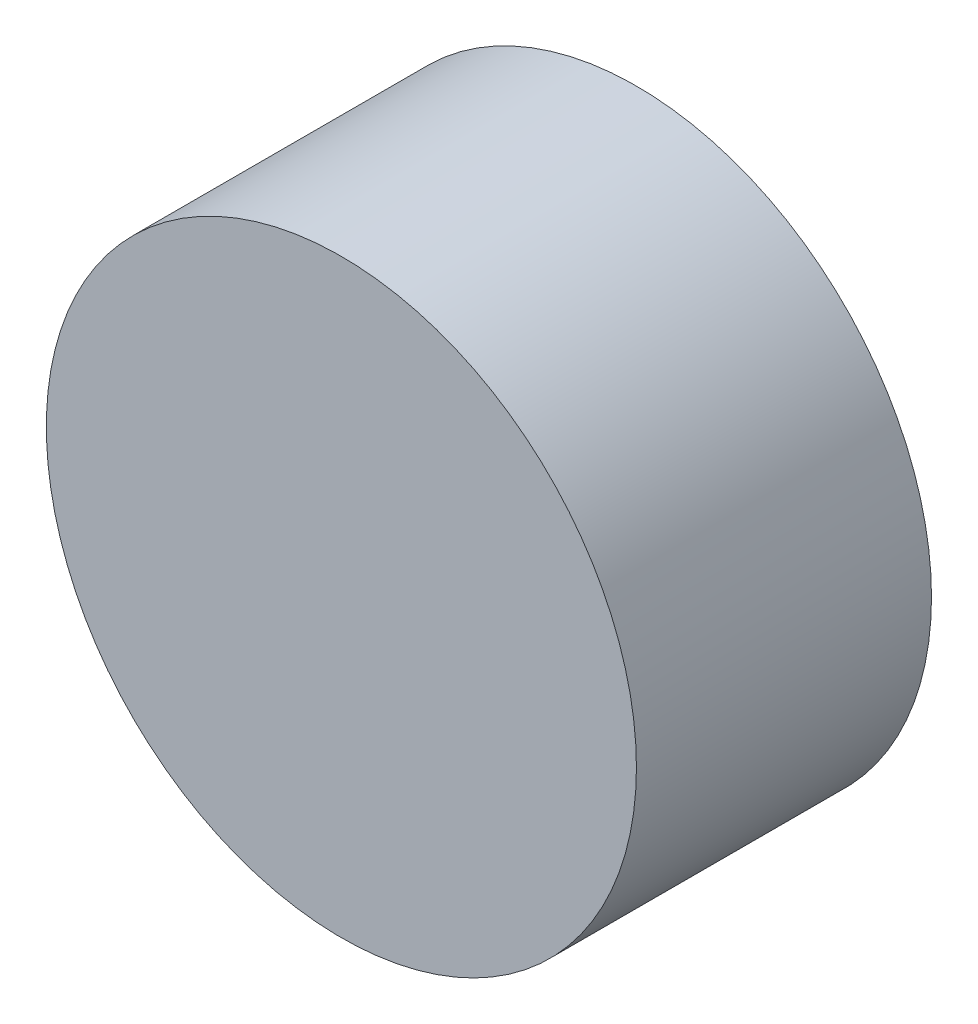
ISO-10303-21;
HEADER;
FILE_DESCRIPTION(('STEP AP214'),'2;1');
FILE_NAME('part.step','',(''),(''),'','','');
FILE_SCHEMA(('AUTOMOTIVE_DESIGN { 1 0 10303 214 1 1 1 1 }'));
ENDSEC;
DATA;
#1=APPLICATION_CONTEXT('core data for automotive mechanical design processes');
#2=APPLICATION_PROTOCOL_DEFINITION('international standard','automotive_design',2000,#1);
#3=PRODUCT_CONTEXT('',#1,'mechanical');
#4=PRODUCT('Part','Part','',(#3));
#5=PRODUCT_RELATED_PRODUCT_CATEGORY('part','',(#4));
#6=PRODUCT_DEFINITION_FORMATION('','',#4);
#7=PRODUCT_DEFINITION_CONTEXT('part definition',#1,'design');
#8=PRODUCT_DEFINITION('design','',#6,#7);
#9=PRODUCT_DEFINITION_SHAPE('','',#8);
#10=(LENGTH_UNIT() NAMED_UNIT(*) SI_UNIT(.MILLI.,.METRE.));
#11=(NAMED_UNIT(*) PLANE_ANGLE_UNIT() SI_UNIT($,.RADIAN.));
#12=(NAMED_UNIT(*) SI_UNIT($,.STERADIAN.) SOLID_ANGLE_UNIT());
#13=UNCERTAINTY_MEASURE_WITH_UNIT(LENGTH_MEASURE(1.E-05),#10,'distance_accuracy_value','');
#14=(GEOMETRIC_REPRESENTATION_CONTEXT(3) GLOBAL_UNCERTAINTY_ASSIGNED_CONTEXT((#13)) GLOBAL_UNIT_ASSIGNED_CONTEXT((#10,
#11,#12)) REPRESENTATION_CONTEXT('',''));
#15=CARTESIAN_POINT('',(0.,0.,0.));
#16=DIRECTION('',(0.,0.,1.));
#17=DIRECTION('',(1.,0.,0.));
#18=AXIS2_PLACEMENT_3D('',#15,#16,#17);
#19=CARTESIAN_POINT('',(-1.35,-0.4,0.801));
#20=DIRECTION('',(0.,0.,1.));
#21=DIRECTION('',(1.,0.,0.));
#22=AXIS2_PLACEMENT_3D('',#19,#20,#21);
#23=PLANE('',#22);
#24=CARTESIAN_POINT('',(-1.35,-0.4,0.801));
#25=DIRECTION('',(0.,0.,1.));
#26=DIRECTION('',(1.,0.,0.));
#27=AXIS2_PLACEMENT_3D('',#24,#25,#26);
#28=CIRCLE('',#27,0.1);
#29=CARTESIAN_POINT('',(-1.25,-0.4,0.801));
#30=VERTEX_POINT('',#29);
#31=EDGE_CURVE('E18',#30,#30,#28,.F.);
#32=ORIENTED_EDGE('',*,*,#31,.F.);
#33=EDGE_LOOP('',(#32));
#34=FACE_BOUND('',#33,.T.);
#35=ADVANCED_FACE('F15',(#34),#23,.T.);
#36=CARTESIAN_POINT('',(-1.35,-0.4,0.701));
#37=DIRECTION('',(0.,0.,1.));
#38=DIRECTION('',(1.,0.,0.));
#39=AXIS2_PLACEMENT_3D('',#36,#37,#38);
#40=PLANE('',#39);
#41=CARTESIAN_POINT('',(-1.35,-0.4,0.701));
#42=DIRECTION('',(0.,0.,1.));
#43=DIRECTION('',(1.,0.,0.));
#44=AXIS2_PLACEMENT_3D('',#41,#42,#43);
#45=CIRCLE('',#44,0.1);
#46=CARTESIAN_POINT('',(-1.25,-0.4,0.701));
#47=VERTEX_POINT('',#46);
#48=EDGE_CURVE('E10',#47,#47,#45,.T.);
#49=ORIENTED_EDGE('',*,*,#48,.F.);
#50=EDGE_LOOP('',(#49));
#51=FACE_BOUND('',#50,.T.);
#52=ADVANCED_FACE('F30',(#51),#40,.F.);
#53=CARTESIAN_POINT('',(-1.35,-0.4,0.701));
#54=DIRECTION('',(0.,0.,1.));
#55=DIRECTION('',(1.,0.,0.));
#56=AXIS2_PLACEMENT_3D('',#53,#54,#55);
#57=CYLINDRICAL_SURFACE('',#56,0.1);
#58=ORIENTED_EDGE('',*,*,#48,.T.);
#59=EDGE_LOOP('',(#58));
#60=FACE_BOUND('',#59,.T.);
#61=ORIENTED_EDGE('',*,*,#31,.T.);
#62=EDGE_LOOP('',(#61));
#63=FACE_BOUND('',#62,.T.);
#64=ADVANCED_FACE('F27',(#60,#63),#57,.T.);
#65=CLOSED_SHELL('',(#35,#52,#64));
#66=MANIFOLD_SOLID_BREP('B1',#65);
#67=ADVANCED_BREP_SHAPE_REPRESENTATION('',(#18,#66),#14);
#68=SHAPE_DEFINITION_REPRESENTATION(#9,#67);
ENDSEC;
END-ISO-10303-21;
